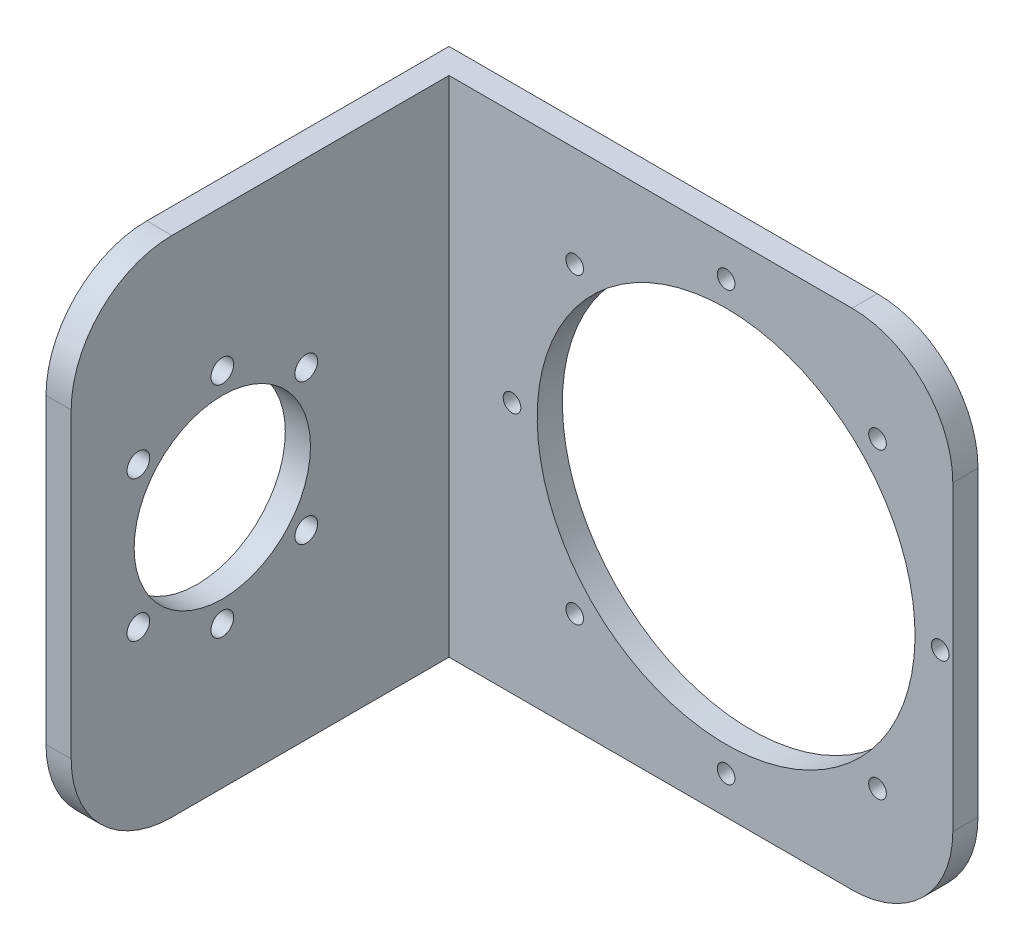
ISO-10303-21;
HEADER;
FILE_DESCRIPTION(('STEP AP214'),'2;1');
FILE_NAME('part.step','',(''),(''),'','','');
FILE_SCHEMA(('AUTOMOTIVE_DESIGN { 1 0 10303 214 1 1 1 1 }'));
ENDSEC;
DATA;
#1=APPLICATION_CONTEXT('core data for automotive mechanical design processes');
#2=APPLICATION_PROTOCOL_DEFINITION('international standard','automotive_design',2000,#1);
#3=PRODUCT_CONTEXT('',#1,'mechanical');
#4=PRODUCT('Part','Part','',(#3));
#5=PRODUCT_RELATED_PRODUCT_CATEGORY('part','',(#4));
#6=PRODUCT_DEFINITION_FORMATION('','',#4);
#7=PRODUCT_DEFINITION_CONTEXT('part definition',#1,'design');
#8=PRODUCT_DEFINITION('design','',#6,#7);
#9=PRODUCT_DEFINITION_SHAPE('','',#8);
#10=(LENGTH_UNIT() NAMED_UNIT(*) SI_UNIT(.MILLI.,.METRE.));
#11=(NAMED_UNIT(*) PLANE_ANGLE_UNIT() SI_UNIT($,.RADIAN.));
#12=(NAMED_UNIT(*) SI_UNIT($,.STERADIAN.) SOLID_ANGLE_UNIT());
#13=UNCERTAINTY_MEASURE_WITH_UNIT(LENGTH_MEASURE(1.E-05),#10,'distance_accuracy_value','');
#14=(GEOMETRIC_REPRESENTATION_CONTEXT(3) GLOBAL_UNCERTAINTY_ASSIGNED_CONTEXT((#13)) GLOBAL_UNIT_ASSIGNED_CONTEXT((#10,
#11,#12)) REPRESENTATION_CONTEXT('',''));
#15=CARTESIAN_POINT('',(0.,0.,0.));
#16=DIRECTION('',(0.,0.,1.));
#17=DIRECTION('',(1.,0.,0.));
#18=AXIS2_PLACEMENT_3D('',#15,#16,#17);
#19=CARTESIAN_POINT('',(5.,50.,40.));
#20=DIRECTION('',(0.,0.,-1.));
#21=DIRECTION('',(0.,1.,0.));
#22=AXIS2_PLACEMENT_3D('',#19,#20,#21);
#23=PLANE('',#22);
#24=DIRECTION('',(0.,-1.,0.));
#25=VECTOR('',#24,1.);
#26=CARTESIAN_POINT('',(5.,50.,40.));
#27=LINE('',#26,#25);
#28=CARTESIAN_POINT('',(5.,30.,40.));
#29=VERTEX_POINT('',#28);
#30=CARTESIAN_POINT('',(5.,-30.,40.));
#31=VERTEX_POINT('',#30);
#32=EDGE_CURVE('E122',#29,#31,#27,.T.);
#33=ORIENTED_EDGE('',*,*,#32,.F.);
#34=DIRECTION('',(-1.,0.,0.));
#35=VECTOR('',#34,1.);
#36=CARTESIAN_POINT('',(5.,30.,40.));
#37=LINE('',#36,#35);
#38=CARTESIAN_POINT('',(0.,30.,40.));
#39=VERTEX_POINT('',#38);
#40=EDGE_CURVE('E216',#29,#39,#37,.T.);
#41=ORIENTED_EDGE('',*,*,#40,.T.);
#42=DIRECTION('',(0.,-1.,0.));
#43=VECTOR('',#42,1.);
#44=CARTESIAN_POINT('',(0.,50.,40.));
#45=LINE('',#44,#43);
#46=CARTESIAN_POINT('',(0.,-30.,40.));
#47=VERTEX_POINT('',#46);
#48=EDGE_CURVE('E148',#39,#47,#45,.T.);
#49=ORIENTED_EDGE('',*,*,#48,.T.);
#50=DIRECTION('',(-1.,0.,0.));
#51=VECTOR('',#50,1.);
#52=CARTESIAN_POINT('',(5.,-30.,40.));
#53=LINE('',#52,#51);
#54=EDGE_CURVE('E50',#47,#31,#53,.F.);
#55=ORIENTED_EDGE('',*,*,#54,.T.);
#56=EDGE_LOOP('',(#33,#41,#49,#55));
#57=FACE_BOUND('',#56,.T.);
#58=ADVANCED_FACE('F35',(#57),#23,.F.);
#59=CARTESIAN_POINT('',(5.,-50.,40.));
#60=DIRECTION('',(0.,1.,0.));
#61=DIRECTION('',(0.,0.,1.));
#62=AXIS2_PLACEMENT_3D('',#59,#60,#61);
#63=PLANE('',#62);
#64=DIRECTION('',(-1.,0.,0.));
#65=VECTOR('',#64,1.);
#66=CARTESIAN_POINT('',(5.,-50.,-40.));
#67=LINE('',#66,#65);
#68=CARTESIAN_POINT('',(85.,-50.,-40.));
#69=VERTEX_POINT('',#68);
#70=CARTESIAN_POINT('',(0.,-50.,-40.));
#71=VERTEX_POINT('',#70);
#72=EDGE_CURVE('E162',#69,#71,#67,.T.);
#73=ORIENTED_EDGE('',*,*,#72,.F.);
#74=DIRECTION('',(0.,0.,-1.));
#75=VECTOR('',#74,1.);
#76=CARTESIAN_POINT('',(85.,-50.,40.));
#77=LINE('',#76,#75);
#78=CARTESIAN_POINT('',(85.,-50.,-35.));
#79=VERTEX_POINT('',#78);
#80=EDGE_CURVE('E129',#69,#79,#77,.F.);
#81=ORIENTED_EDGE('',*,*,#80,.T.);
#82=DIRECTION('',(-1.,0.,0.));
#83=VECTOR('',#82,1.);
#84=CARTESIAN_POINT('',(105.,-50.,-35.));
#85=LINE('',#84,#83);
#86=CARTESIAN_POINT('',(5.,-50.,-35.));
#87=VERTEX_POINT('',#86);
#88=EDGE_CURVE('E125',#79,#87,#85,.T.);
#89=ORIENTED_EDGE('',*,*,#88,.T.);
#90=DIRECTION('',(0.,0.,-1.));
#91=VECTOR('',#90,1.);
#92=CARTESIAN_POINT('',(5.,-50.,40.));
#93=LINE('',#92,#91);
#94=CARTESIAN_POINT('',(5.,-50.,20.));
#95=VERTEX_POINT('',#94);
#96=EDGE_CURVE('E111',#95,#87,#93,.T.);
#97=ORIENTED_EDGE('',*,*,#96,.F.);
#98=DIRECTION('',(-1.,0.,0.));
#99=VECTOR('',#98,1.);
#100=CARTESIAN_POINT('',(5.,-50.,20.));
#101=LINE('',#100,#99);
#102=CARTESIAN_POINT('',(0.,-50.,20.));
#103=VERTEX_POINT('',#102);
#104=EDGE_CURVE('E203',#95,#103,#101,.T.);
#105=ORIENTED_EDGE('',*,*,#104,.T.);
#106=DIRECTION('',(0.,0.,-1.));
#107=VECTOR('',#106,1.);
#108=CARTESIAN_POINT('',(0.,-50.,40.));
#109=LINE('',#108,#107);
#110=EDGE_CURVE('E154',#103,#71,#109,.T.);
#111=ORIENTED_EDGE('',*,*,#110,.T.);
#112=EDGE_LOOP('',(#73,#81,#89,#97,#105,#111));
#113=FACE_BOUND('',#112,.T.);
#114=ADVANCED_FACE('F127',(#113),#63,.F.);
#115=CARTESIAN_POINT('',(5.,50.,-40.));
#116=DIRECTION('',(0.,0.,1.));
#117=DIRECTION('',(0.,-1.,0.));
#118=AXIS2_PLACEMENT_3D('',#115,#116,#117);
#119=PLANE('',#118);
#120=CARTESIAN_POINT('',(60.,42.5,-40.));
#121=DIRECTION('',(0.,0.,-1.));
#122=DIRECTION('',(0.,1.,0.));
#123=AXIS2_PLACEMENT_3D('',#120,#121,#122);
#124=CIRCLE('',#123,1.75);
#125=CARTESIAN_POINT('',(60.,44.25,-40.));
#126=VERTEX_POINT('',#125);
#127=EDGE_CURVE('E170',#126,#126,#124,.T.);
#128=ORIENTED_EDGE('',*,*,#127,.F.);
#129=EDGE_LOOP('',(#128));
#130=FACE_BOUND('',#129,.T.);
#131=CARTESIAN_POINT('',(90.0520382004283,30.0520382004283,-40.));
#132=DIRECTION('',(0.,0.,-1.));
#133=DIRECTION('',(0.,1.,0.));
#134=AXIS2_PLACEMENT_3D('',#131,#132,#133);
#135=CIRCLE('',#134,1.75);
#136=CARTESIAN_POINT('',(90.0520382004283,31.8020382004283,-40.));
#137=VERTEX_POINT('',#136);
#138=EDGE_CURVE('E390',#137,#137,#135,.T.);
#139=ORIENTED_EDGE('',*,*,#138,.F.);
#140=EDGE_LOOP('',(#139));
#141=FACE_BOUND('',#140,.T.);
#142=CARTESIAN_POINT('',(102.5,0.,-40.));
#143=DIRECTION('',(0.,0.,-1.));
#144=DIRECTION('',(0.,1.,0.));
#145=AXIS2_PLACEMENT_3D('',#142,#143,#144);
#146=CIRCLE('',#145,1.75);
#147=CARTESIAN_POINT('',(102.5,1.74999999999999,-40.));
#148=VERTEX_POINT('',#147);
#149=EDGE_CURVE('E387',#148,#148,#146,.T.);
#150=ORIENTED_EDGE('',*,*,#149,.F.);
#151=EDGE_LOOP('',(#150));
#152=FACE_BOUND('',#151,.T.);
#153=CARTESIAN_POINT('',(90.0520382004283,-30.0520382004283,-40.));
#154=DIRECTION('',(0.,0.,-1.));
#155=DIRECTION('',(0.,1.,0.));
#156=AXIS2_PLACEMENT_3D('',#153,#154,#155);
#157=CIRCLE('',#156,1.75000000000001);
#158=CARTESIAN_POINT('',(90.0520382004283,-28.3020382004283,-40.));
#159=VERTEX_POINT('',#158);
#160=EDGE_CURVE('E384',#159,#159,#157,.T.);
#161=ORIENTED_EDGE('',*,*,#160,.F.);
#162=EDGE_LOOP('',(#161));
#163=FACE_BOUND('',#162,.T.);
#164=CARTESIAN_POINT('',(60.,-42.5,-40.));
#165=DIRECTION('',(0.,0.,-1.));
#166=DIRECTION('',(0.,1.,0.));
#167=AXIS2_PLACEMENT_3D('',#164,#165,#166);
#168=CIRCLE('',#167,1.75);
#169=CARTESIAN_POINT('',(60.,-40.75,-40.));
#170=VERTEX_POINT('',#169);
#171=EDGE_CURVE('E380',#170,#170,#168,.T.);
#172=ORIENTED_EDGE('',*,*,#171,.F.);
#173=EDGE_LOOP('',(#172));
#174=FACE_BOUND('',#173,.T.);
#175=CARTESIAN_POINT('',(29.9479617995717,30.0520382004283,-40.));
#176=DIRECTION('',(0.,0.,-1.));
#177=DIRECTION('',(0.,1.,0.));
#178=AXIS2_PLACEMENT_3D('',#175,#176,#177);
#179=CIRCLE('',#178,1.75);
#180=CARTESIAN_POINT('',(29.9479617995717,31.8020382004283,-40.));
#181=VERTEX_POINT('',#180);
#182=EDGE_CURVE('E377',#181,#181,#179,.T.);
#183=ORIENTED_EDGE('',*,*,#182,.F.);
#184=EDGE_LOOP('',(#183));
#185=FACE_BOUND('',#184,.T.);
#186=CARTESIAN_POINT('',(60.,0.,-40.));
#187=DIRECTION('',(0.,0.,-1.));
#188=DIRECTION('',(0.,1.,0.));
#189=AXIS2_PLACEMENT_3D('',#186,#187,#188);
#190=CIRCLE('',#189,37.5);
#191=CARTESIAN_POINT('',(60.,37.5,-40.));
#192=VERTEX_POINT('',#191);
#193=EDGE_CURVE('E374',#192,#192,#190,.T.);
#194=ORIENTED_EDGE('',*,*,#193,.F.);
#195=EDGE_LOOP('',(#194));
#196=FACE_BOUND('',#195,.T.);
#197=CARTESIAN_POINT('',(17.5,0.,-40.));
#198=DIRECTION('',(0.,0.,-1.));
#199=DIRECTION('',(0.,1.,0.));
#200=AXIS2_PLACEMENT_3D('',#197,#198,#199);
#201=CIRCLE('',#200,1.75000000000001);
#202=CARTESIAN_POINT('',(17.5,1.75,-40.));
#203=VERTEX_POINT('',#202);
#204=EDGE_CURVE('E393',#203,#203,#201,.T.);
#205=ORIENTED_EDGE('',*,*,#204,.F.);
#206=EDGE_LOOP('',(#205));
#207=FACE_BOUND('',#206,.T.);
#208=CARTESIAN_POINT('',(29.9479617995717,-30.0520382004283,-40.));
#209=DIRECTION('',(0.,0.,-1.));
#210=DIRECTION('',(0.,1.,0.));
#211=AXIS2_PLACEMENT_3D('',#208,#209,#210);
#212=CIRCLE('',#211,1.75);
#213=CARTESIAN_POINT('',(29.9479617995717,-28.3020382004283,-40.));
#214=VERTEX_POINT('',#213);
#215=EDGE_CURVE('E383',#214,#214,#212,.T.);
#216=ORIENTED_EDGE('',*,*,#215,.F.);
#217=EDGE_LOOP('',(#216));
#218=FACE_BOUND('',#217,.T.);
#219=DIRECTION('',(0.,-1.,0.));
#220=VECTOR('',#219,1.);
#221=CARTESIAN_POINT('',(105.,50.,-40.));
#222=LINE('',#221,#220);
#223=CARTESIAN_POINT('',(105.,30.,-40.));
#224=VERTEX_POINT('',#223);
#225=CARTESIAN_POINT('',(105.,-30.,-40.));
#226=VERTEX_POINT('',#225);
#227=EDGE_CURVE('E137',#224,#226,#222,.T.);
#228=ORIENTED_EDGE('',*,*,#227,.T.);
#229=CARTESIAN_POINT('',(85.,-30.,-40.));
#230=DIRECTION('',(0.,0.,1.));
#231=DIRECTION('',(0.,-1.,0.));
#232=AXIS2_PLACEMENT_3D('',#229,#230,#231);
#233=CIRCLE('',#232,20.);
#234=EDGE_CURVE('E201',#226,#69,#233,.F.);
#235=ORIENTED_EDGE('',*,*,#234,.T.);
#236=ORIENTED_EDGE('',*,*,#72,.T.);
#237=DIRECTION('',(0.,1.,0.));
#238=VECTOR('',#237,1.);
#239=CARTESIAN_POINT('',(0.,50.,-40.));
#240=LINE('',#239,#238);
#241=CARTESIAN_POINT('',(0.,50.,-40.));
#242=VERTEX_POINT('',#241);
#243=EDGE_CURVE('E156',#71,#242,#240,.T.);
#244=ORIENTED_EDGE('',*,*,#243,.T.);
#245=DIRECTION('',(-1.,0.,0.));
#246=VECTOR('',#245,1.);
#247=CARTESIAN_POINT('',(5.,50.,-40.));
#248=LINE('',#247,#246);
#249=CARTESIAN_POINT('',(85.,50.,-40.));
#250=VERTEX_POINT('',#249);
#251=EDGE_CURVE('E152',#250,#242,#248,.T.);
#252=ORIENTED_EDGE('',*,*,#251,.F.);
#253=CARTESIAN_POINT('',(85.,30.,-40.));
#254=DIRECTION('',(0.,0.,1.));
#255=DIRECTION('',(0.,-1.,0.));
#256=AXIS2_PLACEMENT_3D('',#253,#254,#255);
#257=CIRCLE('',#256,20.);
#258=EDGE_CURVE('E199',#250,#224,#257,.F.);
#259=ORIENTED_EDGE('',*,*,#258,.T.);
#260=EDGE_LOOP('',(#228,#235,#236,#244,#252,#259));
#261=FACE_BOUND('',#260,.T.);
#262=ADVANCED_FACE('F237',(#130,#141,#152,#163,#174,#185,#196,#207,#218,#261),#119,.F.);
#263=CARTESIAN_POINT('',(5.,50.,40.));
#264=DIRECTION('',(0.,-1.,0.));
#265=DIRECTION('',(0.,0.,-1.));
#266=AXIS2_PLACEMENT_3D('',#263,#264,#265);
#267=PLANE('',#266);
#268=DIRECTION('',(-1.,0.,0.));
#269=VECTOR('',#268,1.);
#270=CARTESIAN_POINT('',(105.,50.,-35.));
#271=LINE('',#270,#269);
#272=CARTESIAN_POINT('',(85.,50.,-35.));
#273=VERTEX_POINT('',#272);
#274=CARTESIAN_POINT('',(5.,50.,-35.));
#275=VERTEX_POINT('',#274);
#276=EDGE_CURVE('E132',#273,#275,#271,.T.);
#277=ORIENTED_EDGE('',*,*,#276,.F.);
#278=DIRECTION('',(0.,0.,-1.));
#279=VECTOR('',#278,1.);
#280=CARTESIAN_POINT('',(85.,50.,40.));
#281=LINE('',#280,#279);
#282=EDGE_CURVE('E212',#273,#250,#281,.T.);
#283=ORIENTED_EDGE('',*,*,#282,.T.);
#284=ORIENTED_EDGE('',*,*,#251,.T.);
#285=DIRECTION('',(0.,0.,1.));
#286=VECTOR('',#285,1.);
#287=CARTESIAN_POINT('',(0.,50.,40.));
#288=LINE('',#287,#286);
#289=CARTESIAN_POINT('',(0.,50.,20.));
#290=VERTEX_POINT('',#289);
#291=EDGE_CURVE('E149',#242,#290,#288,.T.);
#292=ORIENTED_EDGE('',*,*,#291,.T.);
#293=DIRECTION('',(-1.,0.,0.));
#294=VECTOR('',#293,1.);
#295=CARTESIAN_POINT('',(5.,50.,20.));
#296=LINE('',#295,#294);
#297=CARTESIAN_POINT('',(5.,50.,20.));
#298=VERTEX_POINT('',#297);
#299=EDGE_CURVE('E210',#290,#298,#296,.F.);
#300=ORIENTED_EDGE('',*,*,#299,.T.);
#301=DIRECTION('',(0.,0.,1.));
#302=VECTOR('',#301,1.);
#303=CARTESIAN_POINT('',(5.,50.,40.));
#304=LINE('',#303,#302);
#305=EDGE_CURVE('E121',#275,#298,#304,.T.);
#306=ORIENTED_EDGE('',*,*,#305,.F.);
#307=EDGE_LOOP('',(#277,#283,#284,#292,#300,#306));
#308=FACE_BOUND('',#307,.T.);
#309=ADVANCED_FACE('F231',(#308),#267,.F.);
#310=CARTESIAN_POINT('',(5.,0.,0.));
#311=DIRECTION('',(1.,0.,0.));
#312=DIRECTION('',(0.,0.,-1.));
#313=AXIS2_PLACEMENT_3D('',#310,#311,#312);
#314=PLANE('',#313);
#315=CARTESIAN_POINT('',(5.,21.75,10.));
#316=DIRECTION('',(1.,0.,0.));
#317=DIRECTION('',(0.,0.,-1.));
#318=AXIS2_PLACEMENT_3D('',#315,#316,#317);
#319=CIRCLE('',#318,2.25);
#320=CARTESIAN_POINT('',(5.,21.75,7.75000000000003));
#321=VERTEX_POINT('',#320);
#322=EDGE_CURVE('E138',#321,#321,#319,.T.);
#323=ORIENTED_EDGE('',*,*,#322,.F.);
#324=EDGE_LOOP('',(#323));
#325=FACE_BOUND('',#324,.T.);
#326=CARTESIAN_POINT('',(5.,-13.9806305106823,-6.66146663783768));
#327=DIRECTION('',(1.,0.,0.));
#328=DIRECTION('',(0.,0.,-1.));
#329=AXIS2_PLACEMENT_3D('',#326,#327,#328);
#330=CIRCLE('',#329,2.25);
#331=CARTESIAN_POINT('',(5.,-13.9806305106823,-8.91146663783768));
#332=VERTEX_POINT('',#331);
#333=EDGE_CURVE('E143',#332,#332,#330,.T.);
#334=ORIENTED_EDGE('',*,*,#333,.F.);
#335=EDGE_LOOP('',(#334));
#336=FACE_BOUND('',#335,.T.);
#337=CARTESIAN_POINT('',(5.,0.,10.));
#338=DIRECTION('',(1.,0.,0.));
#339=DIRECTION('',(0.,0.,-1.));
#340=AXIS2_PLACEMENT_3D('',#337,#338,#339);
#341=CIRCLE('',#340,17.5);
#342=CARTESIAN_POINT('',(5.,0.,-7.49999999999998));
#343=VERTEX_POINT('',#342);
#344=EDGE_CURVE('E432',#343,#343,#341,.T.);
#345=ORIENTED_EDGE('',*,*,#344,.F.);
#346=EDGE_LOOP('',(#345));
#347=FACE_BOUND('',#346,.T.);
#348=CARTESIAN_POINT('',(5.,-13.9806305106823,26.6614666378377));
#349=DIRECTION('',(1.,0.,0.));
#350=DIRECTION('',(0.,0.,-1.));
#351=AXIS2_PLACEMENT_3D('',#348,#349,#350);
#352=CIRCLE('',#351,2.25);
#353=CARTESIAN_POINT('',(5.,-13.9806305106823,24.4114666378377));
#354=VERTEX_POINT('',#353);
#355=EDGE_CURVE('E429',#354,#354,#352,.T.);
#356=ORIENTED_EDGE('',*,*,#355,.F.);
#357=EDGE_LOOP('',(#356));
#358=FACE_BOUND('',#357,.T.);
#359=CARTESIAN_POINT('',(5.,-21.75,10.));
#360=DIRECTION('',(1.,0.,0.));
#361=DIRECTION('',(0.,0.,-1.));
#362=AXIS2_PLACEMENT_3D('',#359,#360,#361);
#363=CIRCLE('',#362,2.25);
#364=CARTESIAN_POINT('',(5.,-21.75,7.75000000000003));
#365=VERTEX_POINT('',#364);
#366=EDGE_CURVE('E426',#365,#365,#363,.T.);
#367=ORIENTED_EDGE('',*,*,#366,.F.);
#368=EDGE_LOOP('',(#367));
#369=FACE_BOUND('',#368,.T.);
#370=CARTESIAN_POINT('',(5.,13.9806305106823,26.6614666378377));
#371=DIRECTION('',(1.,0.,0.));
#372=DIRECTION('',(0.,0.,-1.));
#373=AXIS2_PLACEMENT_3D('',#370,#371,#372);
#374=CIRCLE('',#373,2.25);
#375=CARTESIAN_POINT('',(5.,13.9806305106823,24.4114666378377));
#376=VERTEX_POINT('',#375);
#377=EDGE_CURVE('E423',#376,#376,#374,.T.);
#378=ORIENTED_EDGE('',*,*,#377,.F.);
#379=EDGE_LOOP('',(#378));
#380=FACE_BOUND('',#379,.T.);
#381=CARTESIAN_POINT('',(5.,13.9806305106823,-6.66146663783768));
#382=DIRECTION('',(1.,0.,0.));
#383=DIRECTION('',(0.,0.,-1.));
#384=AXIS2_PLACEMENT_3D('',#381,#382,#383);
#385=CIRCLE('',#384,2.25);
#386=CARTESIAN_POINT('',(5.,13.9806305106823,-8.91146663783768));
#387=VERTEX_POINT('',#386);
#388=EDGE_CURVE('E403',#387,#387,#385,.T.);
#389=ORIENTED_EDGE('',*,*,#388,.F.);
#390=EDGE_LOOP('',(#389));
#391=FACE_BOUND('',#390,.T.);
#392=ORIENTED_EDGE('',*,*,#305,.T.);
#393=CARTESIAN_POINT('',(5.,30.,20.));
#394=DIRECTION('',(1.,0.,0.));
#395=DIRECTION('',(0.,0.,-1.));
#396=AXIS2_PLACEMENT_3D('',#393,#394,#395);
#397=CIRCLE('',#396,20.);
#398=EDGE_CURVE('E11',#298,#29,#397,.T.);
#399=ORIENTED_EDGE('',*,*,#398,.T.);
#400=ORIENTED_EDGE('',*,*,#32,.T.);
#401=CARTESIAN_POINT('',(5.,-30.,20.));
#402=DIRECTION('',(1.,0.,0.));
#403=DIRECTION('',(0.,0.,-1.));
#404=AXIS2_PLACEMENT_3D('',#401,#402,#403);
#405=CIRCLE('',#404,20.);
#406=EDGE_CURVE('E43',#31,#95,#405,.T.);
#407=ORIENTED_EDGE('',*,*,#406,.T.);
#408=ORIENTED_EDGE('',*,*,#96,.T.);
#409=DIRECTION('',(0.,-1.,0.));
#410=VECTOR('',#409,1.);
#411=CARTESIAN_POINT('',(5.,50.,-35.));
#412=LINE('',#411,#410);
#413=EDGE_CURVE('E115',#275,#87,#412,.T.);
#414=ORIENTED_EDGE('',*,*,#413,.F.);
#415=EDGE_LOOP('',(#392,#399,#400,#407,#408,#414));
#416=FACE_BOUND('',#415,.T.);
#417=ADVANCED_FACE('F113',(#325,#336,#347,#358,#369,#380,#391,#416),#314,.T.);
#418=CARTESIAN_POINT('',(0.,0.,0.));
#419=DIRECTION('',(1.,0.,0.));
#420=DIRECTION('',(0.,0.,-1.));
#421=AXIS2_PLACEMENT_3D('',#418,#419,#420);
#422=PLANE('',#421);
#423=CARTESIAN_POINT('',(0.,21.75,10.));
#424=DIRECTION('',(-1.,0.,0.));
#425=DIRECTION('',(0.,0.,1.));
#426=AXIS2_PLACEMENT_3D('',#423,#424,#425);
#427=CIRCLE('',#426,2.25);
#428=CARTESIAN_POINT('',(0.,21.75,12.25));
#429=VERTEX_POINT('',#428);
#430=EDGE_CURVE('E400',#429,#429,#427,.T.);
#431=ORIENTED_EDGE('',*,*,#430,.F.);
#432=EDGE_LOOP('',(#431));
#433=FACE_BOUND('',#432,.T.);
#434=CARTESIAN_POINT('',(0.,-13.9806305106823,-6.66146663783768));
#435=DIRECTION('',(-1.,0.,0.));
#436=DIRECTION('',(0.,0.,1.));
#437=AXIS2_PLACEMENT_3D('',#434,#435,#436);
#438=CIRCLE('',#437,2.25);
#439=CARTESIAN_POINT('',(0.,-13.9806305106823,-4.41146663783768));
#440=VERTEX_POINT('',#439);
#441=EDGE_CURVE('E407',#440,#440,#438,.T.);
#442=ORIENTED_EDGE('',*,*,#441,.F.);
#443=EDGE_LOOP('',(#442));
#444=FACE_BOUND('',#443,.T.);
#445=CARTESIAN_POINT('',(0.,0.,10.));
#446=DIRECTION('',(-1.,0.,0.));
#447=DIRECTION('',(0.,0.,1.));
#448=AXIS2_PLACEMENT_3D('',#445,#446,#447);
#449=CIRCLE('',#448,17.5);
#450=CARTESIAN_POINT('',(0.,0.,27.5));
#451=VERTEX_POINT('',#450);
#452=EDGE_CURVE('E194',#451,#451,#449,.T.);
#453=ORIENTED_EDGE('',*,*,#452,.F.);
#454=EDGE_LOOP('',(#453));
#455=FACE_BOUND('',#454,.T.);
#456=CARTESIAN_POINT('',(0.,-13.9806305106823,26.6614666378377));
#457=DIRECTION('',(-1.,0.,0.));
#458=DIRECTION('',(0.,0.,-1.));
#459=AXIS2_PLACEMENT_3D('',#456,#457,#458);
#460=CIRCLE('',#459,2.25);
#461=CARTESIAN_POINT('',(0.,-13.9806305106823,24.4114666378377));
#462=VERTEX_POINT('',#461);
#463=EDGE_CURVE('E410',#462,#462,#460,.T.);
#464=ORIENTED_EDGE('',*,*,#463,.F.);
#465=EDGE_LOOP('',(#464));
#466=FACE_BOUND('',#465,.T.);
#467=CARTESIAN_POINT('',(0.,-21.75,10.));
#468=DIRECTION('',(-1.,0.,0.));
#469=DIRECTION('',(0.,0.,-1.));
#470=AXIS2_PLACEMENT_3D('',#467,#468,#469);
#471=CIRCLE('',#470,2.25);
#472=CARTESIAN_POINT('',(0.,-21.75,7.75000000000003));
#473=VERTEX_POINT('',#472);
#474=EDGE_CURVE('E416',#473,#473,#471,.T.);
#475=ORIENTED_EDGE('',*,*,#474,.F.);
#476=EDGE_LOOP('',(#475));
#477=FACE_BOUND('',#476,.T.);
#478=CARTESIAN_POINT('',(0.,13.9806305106823,26.6614666378377));
#479=DIRECTION('',(-1.,0.,0.));
#480=DIRECTION('',(0.,0.,1.));
#481=AXIS2_PLACEMENT_3D('',#478,#479,#480);
#482=CIRCLE('',#481,2.25);
#483=CARTESIAN_POINT('',(0.,13.9806305106823,28.9114666378377));
#484=VERTEX_POINT('',#483);
#485=EDGE_CURVE('E413',#484,#484,#482,.T.);
#486=ORIENTED_EDGE('',*,*,#485,.F.);
#487=EDGE_LOOP('',(#486));
#488=FACE_BOUND('',#487,.T.);
#489=CARTESIAN_POINT('',(0.,13.9806305106823,-6.66146663783768));
#490=DIRECTION('',(-1.,0.,0.));
#491=DIRECTION('',(0.,0.,-1.));
#492=AXIS2_PLACEMENT_3D('',#489,#490,#491);
#493=CIRCLE('',#492,2.25);
#494=CARTESIAN_POINT('',(0.,13.9806305106823,-8.91146663783768));
#495=VERTEX_POINT('',#494);
#496=EDGE_CURVE('E404',#495,#495,#493,.T.);
#497=ORIENTED_EDGE('',*,*,#496,.F.);
#498=EDGE_LOOP('',(#497));
#499=FACE_BOUND('',#498,.T.);
#500=ORIENTED_EDGE('',*,*,#48,.F.);
#501=CARTESIAN_POINT('',(0.,30.,20.));
#502=DIRECTION('',(1.,0.,0.));
#503=DIRECTION('',(0.,0.,-1.));
#504=AXIS2_PLACEMENT_3D('',#501,#502,#503);
#505=CIRCLE('',#504,20.);
#506=EDGE_CURVE('E221',#39,#290,#505,.F.);
#507=ORIENTED_EDGE('',*,*,#506,.T.);
#508=ORIENTED_EDGE('',*,*,#291,.F.);
#509=ORIENTED_EDGE('',*,*,#243,.F.);
#510=ORIENTED_EDGE('',*,*,#110,.F.);
#511=CARTESIAN_POINT('',(0.,-30.,20.));
#512=DIRECTION('',(1.,0.,0.));
#513=DIRECTION('',(0.,0.,-1.));
#514=AXIS2_PLACEMENT_3D('',#511,#512,#513);
#515=CIRCLE('',#514,20.);
#516=EDGE_CURVE('E219',#103,#47,#515,.F.);
#517=ORIENTED_EDGE('',*,*,#516,.T.);
#518=EDGE_LOOP('',(#500,#507,#508,#509,#510,#517));
#519=FACE_BOUND('',#518,.T.);
#520=ADVANCED_FACE('F225',(#433,#444,#455,#466,#477,#488,#499,#519),#422,.F.);
#521=CARTESIAN_POINT('',(105.,50.,-35.));
#522=DIRECTION('',(0.,0.,-1.));
#523=DIRECTION('',(0.,1.,0.));
#524=AXIS2_PLACEMENT_3D('',#521,#522,#523);
#525=PLANE('',#524);
#526=CARTESIAN_POINT('',(60.,42.5,-35.));
#527=DIRECTION('',(0.,0.,-1.));
#528=DIRECTION('',(0.,1.,0.));
#529=AXIS2_PLACEMENT_3D('',#526,#527,#528);
#530=CIRCLE('',#529,1.75);
#531=CARTESIAN_POINT('',(60.,44.25,-35.));
#532=VERTEX_POINT('',#531);
#533=EDGE_CURVE('E191',#532,#532,#530,.T.);
#534=ORIENTED_EDGE('',*,*,#533,.T.);
#535=EDGE_LOOP('',(#534));
#536=FACE_BOUND('',#535,.T.);
#537=CARTESIAN_POINT('',(90.0520382004283,30.0520382004283,-35.));
#538=DIRECTION('',(0.,0.,-1.));
#539=DIRECTION('',(0.,1.,0.));
#540=AXIS2_PLACEMENT_3D('',#537,#538,#539);
#541=CIRCLE('',#540,1.75);
#542=CARTESIAN_POINT('',(90.0520382004283,31.8020382004283,-35.));
#543=VERTEX_POINT('',#542);
#544=EDGE_CURVE('E188',#543,#543,#541,.T.);
#545=ORIENTED_EDGE('',*,*,#544,.T.);
#546=EDGE_LOOP('',(#545));
#547=FACE_BOUND('',#546,.T.);
#548=CARTESIAN_POINT('',(102.5,0.,-35.));
#549=DIRECTION('',(0.,0.,-1.));
#550=DIRECTION('',(0.,1.,0.));
#551=AXIS2_PLACEMENT_3D('',#548,#549,#550);
#552=CIRCLE('',#551,1.75);
#553=CARTESIAN_POINT('',(102.5,1.74999999999999,-35.));
#554=VERTEX_POINT('',#553);
#555=EDGE_CURVE('E185',#554,#554,#552,.T.);
#556=ORIENTED_EDGE('',*,*,#555,.T.);
#557=EDGE_LOOP('',(#556));
#558=FACE_BOUND('',#557,.T.);
#559=CARTESIAN_POINT('',(90.0520382004283,-30.0520382004283,-35.));
#560=DIRECTION('',(0.,0.,-1.));
#561=DIRECTION('',(0.,1.,0.));
#562=AXIS2_PLACEMENT_3D('',#559,#560,#561);
#563=CIRCLE('',#562,1.75000000000001);
#564=CARTESIAN_POINT('',(90.0520382004283,-28.3020382004283,-35.));
#565=VERTEX_POINT('',#564);
#566=EDGE_CURVE('E182',#565,#565,#563,.T.);
#567=ORIENTED_EDGE('',*,*,#566,.T.);
#568=EDGE_LOOP('',(#567));
#569=FACE_BOUND('',#568,.T.);
#570=CARTESIAN_POINT('',(60.,-42.5,-35.));
#571=DIRECTION('',(0.,0.,-1.));
#572=DIRECTION('',(0.,1.,0.));
#573=AXIS2_PLACEMENT_3D('',#570,#571,#572);
#574=CIRCLE('',#573,1.75);
#575=CARTESIAN_POINT('',(60.,-40.75,-35.));
#576=VERTEX_POINT('',#575);
#577=EDGE_CURVE('E179',#576,#576,#574,.T.);
#578=ORIENTED_EDGE('',*,*,#577,.T.);
#579=EDGE_LOOP('',(#578));
#580=FACE_BOUND('',#579,.T.);
#581=CARTESIAN_POINT('',(29.9479617995717,30.0520382004283,-35.));
#582=DIRECTION('',(0.,0.,-1.));
#583=DIRECTION('',(0.,1.,0.));
#584=AXIS2_PLACEMENT_3D('',#581,#582,#583);
#585=CIRCLE('',#584,1.75);
#586=CARTESIAN_POINT('',(29.9479617995717,31.8020382004283,-35.));
#587=VERTEX_POINT('',#586);
#588=EDGE_CURVE('E176',#587,#587,#585,.T.);
#589=ORIENTED_EDGE('',*,*,#588,.T.);
#590=EDGE_LOOP('',(#589));
#591=FACE_BOUND('',#590,.T.);
#592=CARTESIAN_POINT('',(60.,0.,-35.));
#593=DIRECTION('',(0.,0.,-1.));
#594=DIRECTION('',(0.,1.,0.));
#595=AXIS2_PLACEMENT_3D('',#592,#593,#594);
#596=CIRCLE('',#595,37.5);
#597=CARTESIAN_POINT('',(60.,37.5,-35.));
#598=VERTEX_POINT('',#597);
#599=EDGE_CURVE('E173',#598,#598,#596,.T.);
#600=ORIENTED_EDGE('',*,*,#599,.T.);
#601=EDGE_LOOP('',(#600));
#602=FACE_BOUND('',#601,.T.);
#603=CARTESIAN_POINT('',(17.5,0.,-35.));
#604=DIRECTION('',(0.,0.,-1.));
#605=DIRECTION('',(0.,1.,0.));
#606=AXIS2_PLACEMENT_3D('',#603,#604,#605);
#607=CIRCLE('',#606,1.75000000000001);
#608=CARTESIAN_POINT('',(17.5,1.75,-35.));
#609=VERTEX_POINT('',#608);
#610=EDGE_CURVE('E169',#609,#609,#607,.T.);
#611=ORIENTED_EDGE('',*,*,#610,.T.);
#612=EDGE_LOOP('',(#611));
#613=FACE_BOUND('',#612,.T.);
#614=CARTESIAN_POINT('',(29.9479617995717,-30.0520382004283,-35.));
#615=DIRECTION('',(0.,0.,-1.));
#616=DIRECTION('',(0.,1.,0.));
#617=AXIS2_PLACEMENT_3D('',#614,#615,#616);
#618=CIRCLE('',#617,1.75);
#619=CARTESIAN_POINT('',(29.9479617995717,-28.3020382004283,-35.));
#620=VERTEX_POINT('',#619);
#621=EDGE_CURVE('E166',#620,#620,#618,.T.);
#622=ORIENTED_EDGE('',*,*,#621,.T.);
#623=EDGE_LOOP('',(#622));
#624=FACE_BOUND('',#623,.T.);
#625=ORIENTED_EDGE('',*,*,#88,.F.);
#626=CARTESIAN_POINT('',(85.,-30.,-35.));
#627=DIRECTION('',(0.,0.,-1.));
#628=DIRECTION('',(0.,1.,0.));
#629=AXIS2_PLACEMENT_3D('',#626,#627,#628);
#630=CIRCLE('',#629,20.);
#631=CARTESIAN_POINT('',(105.,-30.,-35.));
#632=VERTEX_POINT('',#631);
#633=EDGE_CURVE('E208',#79,#632,#630,.F.);
#634=ORIENTED_EDGE('',*,*,#633,.T.);
#635=DIRECTION('',(0.,-1.,0.));
#636=VECTOR('',#635,1.);
#637=CARTESIAN_POINT('',(105.,50.,-35.));
#638=LINE('',#637,#636);
#639=CARTESIAN_POINT('',(105.,30.,-35.));
#640=VERTEX_POINT('',#639);
#641=EDGE_CURVE('E133',#640,#632,#638,.T.);
#642=ORIENTED_EDGE('',*,*,#641,.F.);
#643=CARTESIAN_POINT('',(85.,30.,-35.));
#644=DIRECTION('',(0.,0.,-1.));
#645=DIRECTION('',(0.,1.,0.));
#646=AXIS2_PLACEMENT_3D('',#643,#644,#645);
#647=CIRCLE('',#646,20.);
#648=EDGE_CURVE('E206',#640,#273,#647,.F.);
#649=ORIENTED_EDGE('',*,*,#648,.T.);
#650=ORIENTED_EDGE('',*,*,#276,.T.);
#651=ORIENTED_EDGE('',*,*,#413,.T.);
#652=EDGE_LOOP('',(#625,#634,#642,#649,#650,#651));
#653=FACE_BOUND('',#652,.T.);
#654=ADVANCED_FACE('F135',(#536,#547,#558,#569,#580,#591,#602,#613,#624,#653),#525,.F.);
#655=CARTESIAN_POINT('',(105.,0.,0.));
#656=DIRECTION('',(-1.,0.,0.));
#657=DIRECTION('',(0.,0.,1.));
#658=AXIS2_PLACEMENT_3D('',#655,#656,#657);
#659=PLANE('',#658);
#660=ORIENTED_EDGE('',*,*,#641,.T.);
#661=DIRECTION('',(0.,0.,-1.));
#662=VECTOR('',#661,1.);
#663=CARTESIAN_POINT('',(105.,-30.,0.));
#664=LINE('',#663,#662);
#665=EDGE_CURVE('E196',#632,#226,#664,.T.);
#666=ORIENTED_EDGE('',*,*,#665,.T.);
#667=ORIENTED_EDGE('',*,*,#227,.F.);
#668=DIRECTION('',(0.,0.,-1.));
#669=VECTOR('',#668,1.);
#670=CARTESIAN_POINT('',(105.,30.,0.));
#671=LINE('',#670,#669);
#672=EDGE_CURVE('E165',#224,#640,#671,.F.);
#673=ORIENTED_EDGE('',*,*,#672,.T.);
#674=EDGE_LOOP('',(#660,#666,#667,#673));
#675=FACE_BOUND('',#674,.T.);
#676=ADVANCED_FACE('F245',(#675),#659,.F.);
#677=CARTESIAN_POINT('',(100.,13.9806305106823,-6.66146663783768));
#678=DIRECTION('',(-1.,0.,0.));
#679=DIRECTION('',(0.,0.,1.));
#680=AXIS2_PLACEMENT_3D('',#677,#678,#679);
#681=CYLINDRICAL_SURFACE('',#680,2.25);
#682=ORIENTED_EDGE('',*,*,#388,.T.);
#683=EDGE_LOOP('',(#682));
#684=FACE_BOUND('',#683,.T.);
#685=ORIENTED_EDGE('',*,*,#496,.T.);
#686=EDGE_LOOP('',(#685));
#687=FACE_BOUND('',#686,.T.);
#688=ADVANCED_FACE('F282',(#684,#687),#681,.F.);
#689=CARTESIAN_POINT('',(100.,13.9806305106823,26.6614666378377));
#690=DIRECTION('',(-1.,0.,0.));
#691=DIRECTION('',(0.,0.,1.));
#692=AXIS2_PLACEMENT_3D('',#689,#690,#691);
#693=CYLINDRICAL_SURFACE('',#692,2.25);
#694=ORIENTED_EDGE('',*,*,#377,.T.);
#695=EDGE_LOOP('',(#694));
#696=FACE_BOUND('',#695,.T.);
#697=ORIENTED_EDGE('',*,*,#485,.T.);
#698=EDGE_LOOP('',(#697));
#699=FACE_BOUND('',#698,.T.);
#700=ADVANCED_FACE('F291',(#696,#699),#693,.F.);
#701=CARTESIAN_POINT('',(100.,-21.75,10.));
#702=DIRECTION('',(-1.,0.,0.));
#703=DIRECTION('',(0.,0.,1.));
#704=AXIS2_PLACEMENT_3D('',#701,#702,#703);
#705=CYLINDRICAL_SURFACE('',#704,2.25);
#706=ORIENTED_EDGE('',*,*,#366,.T.);
#707=EDGE_LOOP('',(#706));
#708=FACE_BOUND('',#707,.T.);
#709=ORIENTED_EDGE('',*,*,#474,.T.);
#710=EDGE_LOOP('',(#709));
#711=FACE_BOUND('',#710,.T.);
#712=ADVANCED_FACE('F287',(#708,#711),#705,.F.);
#713=CARTESIAN_POINT('',(100.,-13.9806305106823,26.6614666378377));
#714=DIRECTION('',(-1.,0.,0.));
#715=DIRECTION('',(0.,0.,1.));
#716=AXIS2_PLACEMENT_3D('',#713,#714,#715);
#717=CYLINDRICAL_SURFACE('',#716,2.25);
#718=ORIENTED_EDGE('',*,*,#355,.T.);
#719=EDGE_LOOP('',(#718));
#720=FACE_BOUND('',#719,.T.);
#721=ORIENTED_EDGE('',*,*,#463,.T.);
#722=EDGE_LOOP('',(#721));
#723=FACE_BOUND('',#722,.T.);
#724=ADVANCED_FACE('F283',(#720,#723),#717,.F.);
#725=CARTESIAN_POINT('',(100.,0.,10.));
#726=DIRECTION('',(-1.,0.,0.));
#727=DIRECTION('',(0.,0.,1.));
#728=AXIS2_PLACEMENT_3D('',#725,#726,#727);
#729=CYLINDRICAL_SURFACE('',#728,17.5);
#730=ORIENTED_EDGE('',*,*,#344,.T.);
#731=EDGE_LOOP('',(#730));
#732=FACE_BOUND('',#731,.T.);
#733=ORIENTED_EDGE('',*,*,#452,.T.);
#734=EDGE_LOOP('',(#733));
#735=FACE_BOUND('',#734,.T.);
#736=ADVANCED_FACE('F286',(#732,#735),#729,.F.);
#737=CARTESIAN_POINT('',(100.,-13.9806305106823,-6.66146663783768));
#738=DIRECTION('',(-1.,0.,0.));
#739=DIRECTION('',(0.,0.,1.));
#740=AXIS2_PLACEMENT_3D('',#737,#738,#739);
#741=CYLINDRICAL_SURFACE('',#740,2.25);
#742=ORIENTED_EDGE('',*,*,#333,.T.);
#743=EDGE_LOOP('',(#742));
#744=FACE_BOUND('',#743,.T.);
#745=ORIENTED_EDGE('',*,*,#441,.T.);
#746=EDGE_LOOP('',(#745));
#747=FACE_BOUND('',#746,.T.);
#748=ADVANCED_FACE('F299',(#744,#747),#741,.F.);
#749=CARTESIAN_POINT('',(100.,21.75,10.));
#750=DIRECTION('',(-1.,0.,0.));
#751=DIRECTION('',(0.,0.,1.));
#752=AXIS2_PLACEMENT_3D('',#749,#750,#751);
#753=CYLINDRICAL_SURFACE('',#752,2.25);
#754=ORIENTED_EDGE('',*,*,#322,.T.);
#755=EDGE_LOOP('',(#754));
#756=FACE_BOUND('',#755,.T.);
#757=ORIENTED_EDGE('',*,*,#430,.T.);
#758=EDGE_LOOP('',(#757));
#759=FACE_BOUND('',#758,.T.);
#760=ADVANCED_FACE('F302',(#756,#759),#753,.F.);
#761=CARTESIAN_POINT('',(29.9479617995717,-30.0520382004283,-18.0000000000001));
#762=DIRECTION('',(0.,0.,-1.));
#763=DIRECTION('',(0.,1.,0.));
#764=AXIS2_PLACEMENT_3D('',#761,#762,#763);
#765=CYLINDRICAL_SURFACE('',#764,1.75);
#766=ORIENTED_EDGE('',*,*,#215,.T.);
#767=EDGE_LOOP('',(#766));
#768=FACE_BOUND('',#767,.T.);
#769=ORIENTED_EDGE('',*,*,#621,.F.);
#770=EDGE_LOOP('',(#769));
#771=FACE_BOUND('',#770,.T.);
#772=ADVANCED_FACE('F309',(#768,#771),#765,.F.);
#773=CARTESIAN_POINT('',(17.5,0.,-18.0000000000001));
#774=DIRECTION('',(0.,0.,-1.));
#775=DIRECTION('',(0.,1.,0.));
#776=AXIS2_PLACEMENT_3D('',#773,#774,#775);
#777=CYLINDRICAL_SURFACE('',#776,1.75000000000001);
#778=ORIENTED_EDGE('',*,*,#204,.T.);
#779=EDGE_LOOP('',(#778));
#780=FACE_BOUND('',#779,.T.);
#781=ORIENTED_EDGE('',*,*,#610,.F.);
#782=EDGE_LOOP('',(#781));
#783=FACE_BOUND('',#782,.T.);
#784=ADVANCED_FACE('F315',(#780,#783),#777,.F.);
#785=CARTESIAN_POINT('',(60.,0.,-18.0000000000001));
#786=DIRECTION('',(0.,0.,-1.));
#787=DIRECTION('',(0.,1.,0.));
#788=AXIS2_PLACEMENT_3D('',#785,#786,#787);
#789=CYLINDRICAL_SURFACE('',#788,37.5);
#790=ORIENTED_EDGE('',*,*,#193,.T.);
#791=EDGE_LOOP('',(#790));
#792=FACE_BOUND('',#791,.T.);
#793=ORIENTED_EDGE('',*,*,#599,.F.);
#794=EDGE_LOOP('',(#793));
#795=FACE_BOUND('',#794,.T.);
#796=ADVANCED_FACE('F311',(#792,#795),#789,.F.);
#797=CARTESIAN_POINT('',(29.9479617995717,30.0520382004283,-18.0000000000001));
#798=DIRECTION('',(0.,0.,-1.));
#799=DIRECTION('',(0.,1.,0.));
#800=AXIS2_PLACEMENT_3D('',#797,#798,#799);
#801=CYLINDRICAL_SURFACE('',#800,1.75);
#802=ORIENTED_EDGE('',*,*,#182,.T.);
#803=EDGE_LOOP('',(#802));
#804=FACE_BOUND('',#803,.T.);
#805=ORIENTED_EDGE('',*,*,#588,.F.);
#806=EDGE_LOOP('',(#805));
#807=FACE_BOUND('',#806,.T.);
#808=ADVANCED_FACE('F314',(#804,#807),#801,.F.);
#809=CARTESIAN_POINT('',(60.,-42.5,-18.0000000000001));
#810=DIRECTION('',(0.,0.,-1.));
#811=DIRECTION('',(0.,1.,0.));
#812=AXIS2_PLACEMENT_3D('',#809,#810,#811);
#813=CYLINDRICAL_SURFACE('',#812,1.75);
#814=ORIENTED_EDGE('',*,*,#171,.T.);
#815=EDGE_LOOP('',(#814));
#816=FACE_BOUND('',#815,.T.);
#817=ORIENTED_EDGE('',*,*,#577,.F.);
#818=EDGE_LOOP('',(#817));
#819=FACE_BOUND('',#818,.T.);
#820=ADVANCED_FACE('F319',(#816,#819),#813,.F.);
#821=CARTESIAN_POINT('',(90.0520382004283,-30.0520382004283,-18.0000000000001));
#822=DIRECTION('',(0.,0.,-1.));
#823=DIRECTION('',(0.,1.,0.));
#824=AXIS2_PLACEMENT_3D('',#821,#822,#823);
#825=CYLINDRICAL_SURFACE('',#824,1.75000000000001);
#826=ORIENTED_EDGE('',*,*,#160,.T.);
#827=EDGE_LOOP('',(#826));
#828=FACE_BOUND('',#827,.T.);
#829=ORIENTED_EDGE('',*,*,#566,.F.);
#830=EDGE_LOOP('',(#829));
#831=FACE_BOUND('',#830,.T.);
#832=ADVANCED_FACE('F334',(#828,#831),#825,.F.);
#833=CARTESIAN_POINT('',(102.5,0.,-18.0000000000001));
#834=DIRECTION('',(0.,0.,-1.));
#835=DIRECTION('',(0.,1.,0.));
#836=AXIS2_PLACEMENT_3D('',#833,#834,#835);
#837=CYLINDRICAL_SURFACE('',#836,1.75);
#838=ORIENTED_EDGE('',*,*,#149,.T.);
#839=EDGE_LOOP('',(#838));
#840=FACE_BOUND('',#839,.T.);
#841=ORIENTED_EDGE('',*,*,#555,.F.);
#842=EDGE_LOOP('',(#841));
#843=FACE_BOUND('',#842,.T.);
#844=ADVANCED_FACE('F330',(#840,#843),#837,.F.);
#845=CARTESIAN_POINT('',(90.0520382004283,30.0520382004283,-18.0000000000001));
#846=DIRECTION('',(0.,0.,-1.));
#847=DIRECTION('',(0.,1.,0.));
#848=AXIS2_PLACEMENT_3D('',#845,#846,#847);
#849=CYLINDRICAL_SURFACE('',#848,1.75);
#850=ORIENTED_EDGE('',*,*,#138,.T.);
#851=EDGE_LOOP('',(#850));
#852=FACE_BOUND('',#851,.T.);
#853=ORIENTED_EDGE('',*,*,#544,.F.);
#854=EDGE_LOOP('',(#853));
#855=FACE_BOUND('',#854,.T.);
#856=ADVANCED_FACE('F327',(#852,#855),#849,.F.);
#857=CARTESIAN_POINT('',(60.,42.5,-18.0000000000001));
#858=DIRECTION('',(0.,0.,-1.));
#859=DIRECTION('',(0.,1.,0.));
#860=AXIS2_PLACEMENT_3D('',#857,#858,#859);
#861=CYLINDRICAL_SURFACE('',#860,1.75);
#862=ORIENTED_EDGE('',*,*,#127,.T.);
#863=EDGE_LOOP('',(#862));
#864=FACE_BOUND('',#863,.T.);
#865=ORIENTED_EDGE('',*,*,#533,.F.);
#866=EDGE_LOOP('',(#865));
#867=FACE_BOUND('',#866,.T.);
#868=ADVANCED_FACE('F257',(#864,#867),#861,.F.);
#869=CARTESIAN_POINT('',(85.,-30.,0.));
#870=DIRECTION('',(0.,0.,-1.));
#871=DIRECTION('',(0.,1.,0.));
#872=AXIS2_PLACEMENT_3D('',#869,#870,#871);
#873=CYLINDRICAL_SURFACE('',#872,20.);
#874=ORIENTED_EDGE('',*,*,#633,.F.);
#875=ORIENTED_EDGE('',*,*,#80,.F.);
#876=ORIENTED_EDGE('',*,*,#234,.F.);
#877=ORIENTED_EDGE('',*,*,#665,.F.);
#878=EDGE_LOOP('',(#874,#875,#876,#877));
#879=FACE_BOUND('',#878,.T.);
#880=ADVANCED_FACE('F239',(#879),#873,.T.);
#881=CARTESIAN_POINT('',(85.,30.,40.));
#882=DIRECTION('',(0.,0.,-1.));
#883=DIRECTION('',(0.,1.,0.));
#884=AXIS2_PLACEMENT_3D('',#881,#882,#883);
#885=CYLINDRICAL_SURFACE('',#884,20.);
#886=ORIENTED_EDGE('',*,*,#648,.F.);
#887=ORIENTED_EDGE('',*,*,#672,.F.);
#888=ORIENTED_EDGE('',*,*,#258,.F.);
#889=ORIENTED_EDGE('',*,*,#282,.F.);
#890=EDGE_LOOP('',(#886,#887,#888,#889));
#891=FACE_BOUND('',#890,.T.);
#892=ADVANCED_FACE('F249',(#891),#885,.T.);
#893=CARTESIAN_POINT('',(5.,30.,20.));
#894=DIRECTION('',(-1.,0.,0.));
#895=DIRECTION('',(0.,0.,1.));
#896=AXIS2_PLACEMENT_3D('',#893,#894,#895);
#897=CYLINDRICAL_SURFACE('',#896,20.);
#898=ORIENTED_EDGE('',*,*,#398,.F.);
#899=ORIENTED_EDGE('',*,*,#299,.F.);
#900=ORIENTED_EDGE('',*,*,#506,.F.);
#901=ORIENTED_EDGE('',*,*,#40,.F.);
#902=EDGE_LOOP('',(#898,#899,#900,#901));
#903=FACE_BOUND('',#902,.T.);
#904=ADVANCED_FACE('F233',(#903),#897,.T.);
#905=CARTESIAN_POINT('',(5.,-30.,20.));
#906=DIRECTION('',(-1.,0.,0.));
#907=DIRECTION('',(0.,0.,1.));
#908=AXIS2_PLACEMENT_3D('',#905,#906,#907);
#909=CYLINDRICAL_SURFACE('',#908,20.);
#910=ORIENTED_EDGE('',*,*,#406,.F.);
#911=ORIENTED_EDGE('',*,*,#54,.F.);
#912=ORIENTED_EDGE('',*,*,#516,.F.);
#913=ORIENTED_EDGE('',*,*,#104,.F.);
#914=EDGE_LOOP('',(#910,#911,#912,#913));
#915=FACE_BOUND('',#914,.T.);
#916=ADVANCED_FACE('F37',(#915),#909,.T.);
#917=CLOSED_SHELL('',(#58,#114,#262,#309,#417,#520,#654,#676,#688,#700,#712,#724,#736,#748,#760,
#772,#784,#796,#808,#820,#832,#844,#856,#868,#880,#892,#904,#916));
#918=MANIFOLD_SOLID_BREP('B2',#917);
#919=ADVANCED_BREP_SHAPE_REPRESENTATION('',(#18,#918),#14);
#920=SHAPE_DEFINITION_REPRESENTATION(#9,#919);
ENDSEC;
END-ISO-10303-21;
